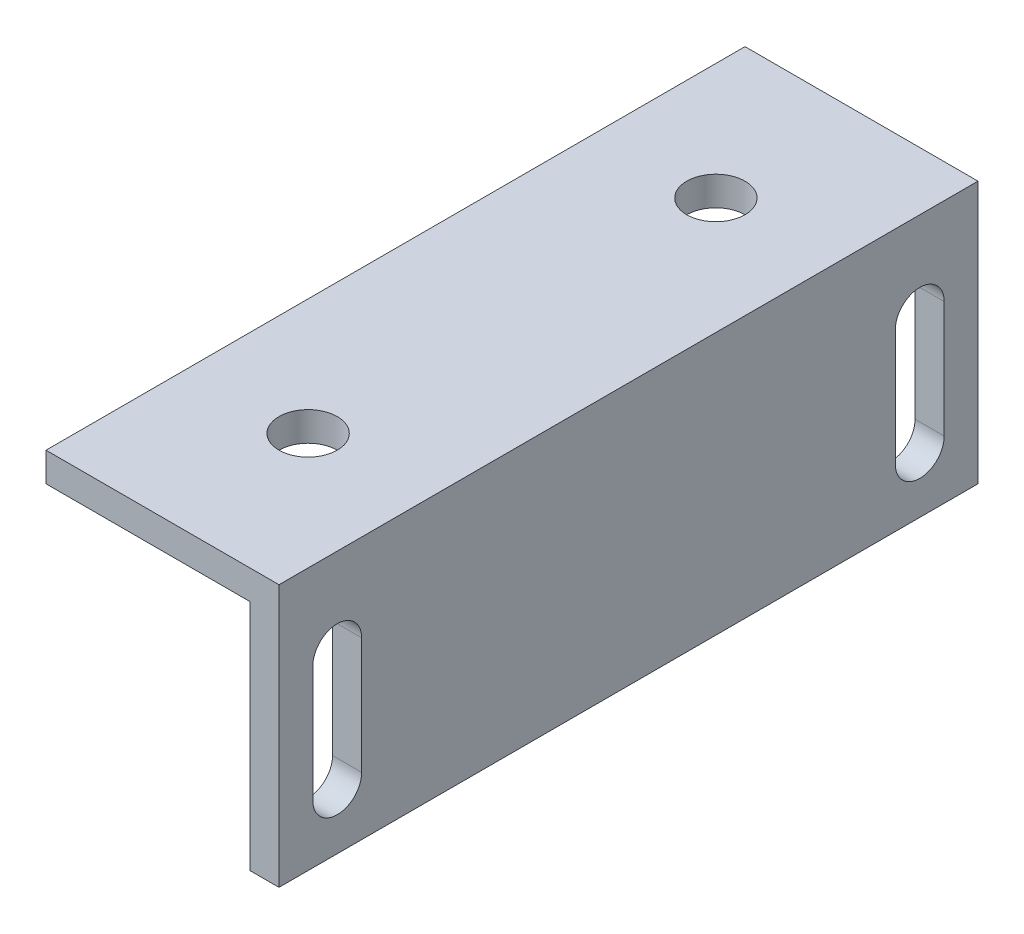
ISO-10303-21;
HEADER;
FILE_DESCRIPTION(('STEP AP214'),'2;1');
FILE_NAME('part.step','',(''),(''),'','','');
FILE_SCHEMA(('AUTOMOTIVE_DESIGN { 1 0 10303 214 1 1 1 1 }'));
ENDSEC;
DATA;
#1=APPLICATION_CONTEXT('core data for automotive mechanical design processes');
#2=APPLICATION_PROTOCOL_DEFINITION('international standard','automotive_design',2000,#1);
#3=PRODUCT_CONTEXT('',#1,'mechanical');
#4=PRODUCT('Part','Part','',(#3));
#5=PRODUCT_RELATED_PRODUCT_CATEGORY('part','',(#4));
#6=PRODUCT_DEFINITION_FORMATION('','',#4);
#7=PRODUCT_DEFINITION_CONTEXT('part definition',#1,'design');
#8=PRODUCT_DEFINITION('design','',#6,#7);
#9=PRODUCT_DEFINITION_SHAPE('','',#8);
#10=(LENGTH_UNIT() NAMED_UNIT(*) SI_UNIT(.MILLI.,.METRE.));
#11=(NAMED_UNIT(*) PLANE_ANGLE_UNIT() SI_UNIT($,.RADIAN.));
#12=(NAMED_UNIT(*) SI_UNIT($,.STERADIAN.) SOLID_ANGLE_UNIT());
#13=UNCERTAINTY_MEASURE_WITH_UNIT(LENGTH_MEASURE(1.E-05),#10,'distance_accuracy_value','');
#14=(GEOMETRIC_REPRESENTATION_CONTEXT(3) GLOBAL_UNCERTAINTY_ASSIGNED_CONTEXT((#13)) GLOBAL_UNIT_ASSIGNED_CONTEXT((#10,
#11,#12)) REPRESENTATION_CONTEXT('',''));
#15=CARTESIAN_POINT('',(0.,0.,0.));
#16=DIRECTION('',(0.,0.,1.));
#17=DIRECTION('',(1.,0.,0.));
#18=AXIS2_PLACEMENT_3D('',#15,#16,#17);
#19=CARTESIAN_POINT('',(0.,-50.8,76.2));
#20=DIRECTION('',(-1.,0.,0.));
#21=DIRECTION('',(0.,0.,1.));
#22=AXIS2_PLACEMENT_3D('',#19,#20,#21);
#23=PLANE('',#22);
#24=DIRECTION('',(0.,-1.,0.));
#25=VECTOR('',#24,1.);
#26=CARTESIAN_POINT('',(0.,-9.525,72.515));
#27=LINE('',#26,#25);
#28=CARTESIAN_POINT('',(0.,-9.525,72.515));
#29=VERTEX_POINT('',#28);
#30=CARTESIAN_POINT('',(0.,-22.225,72.515));
#31=VERTEX_POINT('',#30);
#32=EDGE_CURVE('E169',#29,#31,#27,.T.);
#33=ORIENTED_EDGE('',*,*,#32,.F.);
#34=CARTESIAN_POINT('',(0.,-9.525,69.85));
#35=DIRECTION('',(-1.,0.,0.));
#36=DIRECTION('',(0.,0.,1.));
#37=AXIS2_PLACEMENT_3D('',#34,#35,#36);
#38=CIRCLE('',#37,2.66499999999999);
#39=CARTESIAN_POINT('',(0.,-9.525,67.185));
#40=VERTEX_POINT('',#39);
#41=EDGE_CURVE('E150',#40,#29,#38,.F.);
#42=ORIENTED_EDGE('',*,*,#41,.F.);
#43=DIRECTION('',(0.,1.,0.));
#44=VECTOR('',#43,1.);
#45=CARTESIAN_POINT('',(0.,-9.525,67.185));
#46=LINE('',#45,#44);
#47=CARTESIAN_POINT('',(0.,-22.225,67.185));
#48=VERTEX_POINT('',#47);
#49=EDGE_CURVE('E161',#48,#40,#46,.T.);
#50=ORIENTED_EDGE('',*,*,#49,.F.);
#51=CARTESIAN_POINT('',(0.,-22.225,69.85));
#52=DIRECTION('',(-1.,0.,0.));
#53=DIRECTION('',(0.,0.,1.));
#54=AXIS2_PLACEMENT_3D('',#51,#52,#53);
#55=CIRCLE('',#54,2.66499999999999);
#56=EDGE_CURVE('E60',#31,#48,#55,.F.);
#57=ORIENTED_EDGE('',*,*,#56,.F.);
#58=EDGE_LOOP('',(#33,#42,#50,#57));
#59=FACE_BOUND('',#58,.T.);
#60=DIRECTION('',(0.,-1.,0.));
#61=VECTOR('',#60,1.);
#62=CARTESIAN_POINT('',(0.,-9.52499999999993,9.015));
#63=LINE('',#62,#61);
#64=CARTESIAN_POINT('',(0.,-9.52499999999993,9.015));
#65=VERTEX_POINT('',#64);
#66=CARTESIAN_POINT('',(0.,-22.2249999999999,9.01499999999997));
#67=VERTEX_POINT('',#66);
#68=EDGE_CURVE('E187',#65,#67,#63,.T.);
#69=ORIENTED_EDGE('',*,*,#68,.F.);
#70=CARTESIAN_POINT('',(0.,-9.52499999999993,6.35000000000001));
#71=DIRECTION('',(-1.,0.,0.));
#72=DIRECTION('',(0.,0.,1.));
#73=AXIS2_PLACEMENT_3D('',#70,#71,#72);
#74=CIRCLE('',#73,2.66499999999999);
#75=CARTESIAN_POINT('',(0.,-9.52499999999992,3.68500000000002));
#76=VERTEX_POINT('',#75);
#77=EDGE_CURVE('E190',#76,#65,#74,.F.);
#78=ORIENTED_EDGE('',*,*,#77,.F.);
#79=DIRECTION('',(0.,1.,0.));
#80=VECTOR('',#79,1.);
#81=CARTESIAN_POINT('',(0.,-9.52499999999992,3.68500000000002));
#82=LINE('',#81,#80);
#83=CARTESIAN_POINT('',(0.,-22.2249999999999,3.68499999999999));
#84=VERTEX_POINT('',#83);
#85=EDGE_CURVE('E207',#84,#76,#82,.T.);
#86=ORIENTED_EDGE('',*,*,#85,.F.);
#87=CARTESIAN_POINT('',(0.,-22.2249999999999,6.34999999999998));
#88=DIRECTION('',(-1.,0.,0.));
#89=DIRECTION('',(0.,0.,1.));
#90=AXIS2_PLACEMENT_3D('',#87,#88,#89);
#91=CIRCLE('',#90,2.66499999999999);
#92=EDGE_CURVE('E68',#67,#84,#91,.F.);
#93=ORIENTED_EDGE('',*,*,#92,.F.);
#94=EDGE_LOOP('',(#69,#78,#86,#93));
#95=FACE_BOUND('',#94,.T.);
#96=DIRECTION('',(0.,1.,0.));
#97=VECTOR('',#96,1.);
#98=CARTESIAN_POINT('',(0.,-50.8,76.2));
#99=LINE('',#98,#97);
#100=CARTESIAN_POINT('',(0.,-28.575,76.2));
#101=VERTEX_POINT('',#100);
#102=CARTESIAN_POINT('',(0.,0.,76.2));
#103=VERTEX_POINT('',#102);
#104=EDGE_CURVE('E238',#101,#103,#99,.T.);
#105=ORIENTED_EDGE('',*,*,#104,.F.);
#106=DIRECTION('',(0.,0.,1.));
#107=VECTOR('',#106,1.);
#108=CARTESIAN_POINT('',(0.,-28.575,-0.001000000000001));
#109=LINE('',#108,#107);
#110=CARTESIAN_POINT('',(0.,-28.575,0.));
#111=VERTEX_POINT('',#110);
#112=EDGE_CURVE('E217',#111,#101,#109,.T.);
#113=ORIENTED_EDGE('',*,*,#112,.F.);
#114=DIRECTION('',(0.,1.,0.));
#115=VECTOR('',#114,1.);
#116=CARTESIAN_POINT('',(0.,-50.8,0.));
#117=LINE('',#116,#115);
#118=CARTESIAN_POINT('',(0.,0.,0.));
#119=VERTEX_POINT('',#118);
#120=EDGE_CURVE('E233',#111,#119,#117,.T.);
#121=ORIENTED_EDGE('',*,*,#120,.T.);
#122=DIRECTION('',(0.,0.,-1.));
#123=VECTOR('',#122,1.);
#124=CARTESIAN_POINT('',(0.,0.,76.2));
#125=LINE('',#124,#123);
#126=EDGE_CURVE('E13',#103,#119,#125,.T.);
#127=ORIENTED_EDGE('',*,*,#126,.F.);
#128=EDGE_LOOP('',(#105,#113,#121,#127));
#129=FACE_BOUND('',#128,.T.);
#130=ADVANCED_FACE('F46',(#59,#95,#129),#23,.F.);
#131=CARTESIAN_POINT('',(0.,0.,76.2));
#132=DIRECTION('',(0.,-1.,0.));
#133=DIRECTION('',(0.,0.,-1.));
#134=AXIS2_PLACEMENT_3D('',#131,#132,#133);
#135=PLANE('',#134);
#136=CARTESIAN_POINT('',(-12.7,0.,15.875));
#137=DIRECTION('',(0.,1.,0.));
#138=DIRECTION('',(0.,0.,1.));
#139=AXIS2_PLACEMENT_3D('',#136,#137,#138);
#140=CIRCLE('',#139,3.175);
#141=CARTESIAN_POINT('',(-12.7,0.,19.05));
#142=VERTEX_POINT('',#141);
#143=EDGE_CURVE('E226',#142,#142,#140,.T.);
#144=ORIENTED_EDGE('',*,*,#143,.F.);
#145=EDGE_LOOP('',(#144));
#146=FACE_BOUND('',#145,.T.);
#147=CARTESIAN_POINT('',(-12.7,0.,60.325));
#148=DIRECTION('',(0.,1.,0.));
#149=DIRECTION('',(0.,0.,1.));
#150=AXIS2_PLACEMENT_3D('',#147,#148,#149);
#151=CIRCLE('',#150,3.175);
#152=CARTESIAN_POINT('',(-12.7,0.,63.5));
#153=VERTEX_POINT('',#152);
#154=EDGE_CURVE('E225',#153,#153,#151,.T.);
#155=ORIENTED_EDGE('',*,*,#154,.F.);
#156=EDGE_LOOP('',(#155));
#157=FACE_BOUND('',#156,.T.);
#158=DIRECTION('',(-1.,0.,0.));
#159=VECTOR('',#158,1.);
#160=CARTESIAN_POINT('',(0.,0.,0.));
#161=LINE('',#160,#159);
#162=CARTESIAN_POINT('',(-25.4,0.,0.));
#163=VERTEX_POINT('',#162);
#164=EDGE_CURVE('E252',#119,#163,#161,.T.);
#165=ORIENTED_EDGE('',*,*,#164,.T.);
#166=DIRECTION('',(0.,0.,-1.));
#167=VECTOR('',#166,1.);
#168=CARTESIAN_POINT('',(-25.4,0.,76.2));
#169=LINE('',#168,#167);
#170=CARTESIAN_POINT('',(-25.4,0.,76.2));
#171=VERTEX_POINT('',#170);
#172=EDGE_CURVE('E53',#171,#163,#169,.T.);
#173=ORIENTED_EDGE('',*,*,#172,.F.);
#174=DIRECTION('',(-1.,0.,0.));
#175=VECTOR('',#174,1.);
#176=CARTESIAN_POINT('',(0.,0.,76.2));
#177=LINE('',#176,#175);
#178=EDGE_CURVE('E240',#103,#171,#177,.T.);
#179=ORIENTED_EDGE('',*,*,#178,.F.);
#180=ORIENTED_EDGE('',*,*,#126,.T.);
#181=EDGE_LOOP('',(#165,#173,#179,#180));
#182=FACE_BOUND('',#181,.T.);
#183=ADVANCED_FACE('F291',(#146,#157,#182),#135,.F.);
#184=CARTESIAN_POINT('',(-25.4,0.,76.2));
#185=DIRECTION('',(1.,0.,0.));
#186=DIRECTION('',(0.,0.,-1.));
#187=AXIS2_PLACEMENT_3D('',#184,#185,#186);
#188=PLANE('',#187);
#189=DIRECTION('',(0.,-1.,0.));
#190=VECTOR('',#189,1.);
#191=CARTESIAN_POINT('',(-25.4,0.,0.));
#192=LINE('',#191,#190);
#193=CARTESIAN_POINT('',(-25.4,-3.175,0.));
#194=VERTEX_POINT('',#193);
#195=EDGE_CURVE('E254',#163,#194,#192,.T.);
#196=ORIENTED_EDGE('',*,*,#195,.T.);
#197=DIRECTION('',(0.,0.,-1.));
#198=VECTOR('',#197,1.);
#199=CARTESIAN_POINT('',(-25.4,-3.175,76.2));
#200=LINE('',#199,#198);
#201=CARTESIAN_POINT('',(-25.4,-3.175,76.2));
#202=VERTEX_POINT('',#201);
#203=EDGE_CURVE('E262',#202,#194,#200,.T.);
#204=ORIENTED_EDGE('',*,*,#203,.F.);
#205=DIRECTION('',(0.,-1.,0.));
#206=VECTOR('',#205,1.);
#207=CARTESIAN_POINT('',(-25.4,0.,76.2));
#208=LINE('',#207,#206);
#209=EDGE_CURVE('E243',#171,#202,#208,.T.);
#210=ORIENTED_EDGE('',*,*,#209,.F.);
#211=ORIENTED_EDGE('',*,*,#172,.T.);
#212=EDGE_LOOP('',(#196,#204,#210,#211));
#213=FACE_BOUND('',#212,.T.);
#214=ADVANCED_FACE('F269',(#213),#188,.F.);
#215=CARTESIAN_POINT('',(-3.175,-3.175,76.2));
#216=DIRECTION('',(0.,1.,0.));
#217=DIRECTION('',(0.,0.,1.));
#218=AXIS2_PLACEMENT_3D('',#215,#216,#217);
#219=PLANE('',#218);
#220=CARTESIAN_POINT('',(-12.7,-3.175,15.875));
#221=DIRECTION('',(0.,1.,0.));
#222=DIRECTION('',(0.,0.,1.));
#223=AXIS2_PLACEMENT_3D('',#220,#221,#222);
#224=CIRCLE('',#223,3.175);
#225=CARTESIAN_POINT('',(-12.7,-3.175,19.05));
#226=VERTEX_POINT('',#225);
#227=EDGE_CURVE('E229',#226,#226,#224,.F.);
#228=ORIENTED_EDGE('',*,*,#227,.F.);
#229=EDGE_LOOP('',(#228));
#230=FACE_BOUND('',#229,.T.);
#231=CARTESIAN_POINT('',(-12.7,-3.175,60.325));
#232=DIRECTION('',(0.,1.,0.));
#233=DIRECTION('',(0.,0.,1.));
#234=AXIS2_PLACEMENT_3D('',#231,#232,#233);
#235=CIRCLE('',#234,3.175);
#236=CARTESIAN_POINT('',(-12.7,-3.175,63.5));
#237=VERTEX_POINT('',#236);
#238=EDGE_CURVE('E230',#237,#237,#235,.F.);
#239=ORIENTED_EDGE('',*,*,#238,.F.);
#240=EDGE_LOOP('',(#239));
#241=FACE_BOUND('',#240,.T.);
#242=DIRECTION('',(1.,0.,0.));
#243=VECTOR('',#242,1.);
#244=CARTESIAN_POINT('',(-3.175,-3.175,0.));
#245=LINE('',#244,#243);
#246=CARTESIAN_POINT('',(-3.175,-3.175,0.));
#247=VERTEX_POINT('',#246);
#248=EDGE_CURVE('E256',#194,#247,#245,.T.);
#249=ORIENTED_EDGE('',*,*,#248,.T.);
#250=DIRECTION('',(0.,0.,-1.));
#251=VECTOR('',#250,1.);
#252=CARTESIAN_POINT('',(-3.175,-3.175,76.2));
#253=LINE('',#252,#251);
#254=CARTESIAN_POINT('',(-3.175,-3.175,76.2));
#255=VERTEX_POINT('',#254);
#256=EDGE_CURVE('E250',#255,#247,#253,.T.);
#257=ORIENTED_EDGE('',*,*,#256,.F.);
#258=DIRECTION('',(1.,0.,0.));
#259=VECTOR('',#258,1.);
#260=CARTESIAN_POINT('',(-3.175,-3.175,76.2));
#261=LINE('',#260,#259);
#262=EDGE_CURVE('E245',#202,#255,#261,.T.);
#263=ORIENTED_EDGE('',*,*,#262,.F.);
#264=ORIENTED_EDGE('',*,*,#203,.T.);
#265=EDGE_LOOP('',(#249,#257,#263,#264));
#266=FACE_BOUND('',#265,.T.);
#267=ADVANCED_FACE('F281',(#230,#241,#266),#219,.F.);
#268=CARTESIAN_POINT('',(-3.175,-50.8,76.2));
#269=DIRECTION('',(1.,0.,0.));
#270=DIRECTION('',(0.,0.,-1.));
#271=AXIS2_PLACEMENT_3D('',#268,#269,#270);
#272=PLANE('',#271);
#273=DIRECTION('',(0.,-1.,0.));
#274=VECTOR('',#273,1.);
#275=CARTESIAN_POINT('',(-3.175,-9.525,67.185));
#276=LINE('',#275,#274);
#277=CARTESIAN_POINT('',(-3.175,-9.525,67.185));
#278=VERTEX_POINT('',#277);
#279=CARTESIAN_POINT('',(-3.175,-22.225,67.185));
#280=VERTEX_POINT('',#279);
#281=EDGE_CURVE('E171',#278,#280,#276,.T.);
#282=ORIENTED_EDGE('',*,*,#281,.F.);
#283=CARTESIAN_POINT('',(-3.175,-9.525,69.85));
#284=DIRECTION('',(-1.,0.,0.));
#285=DIRECTION('',(0.,0.,1.));
#286=AXIS2_PLACEMENT_3D('',#283,#284,#285);
#287=CIRCLE('',#286,2.66499999999999);
#288=CARTESIAN_POINT('',(-3.175,-9.525,72.515));
#289=VERTEX_POINT('',#288);
#290=EDGE_CURVE('E153',#289,#278,#287,.T.);
#291=ORIENTED_EDGE('',*,*,#290,.F.);
#292=DIRECTION('',(0.,1.,0.));
#293=VECTOR('',#292,1.);
#294=CARTESIAN_POINT('',(-3.175,-9.525,72.515));
#295=LINE('',#294,#293);
#296=CARTESIAN_POINT('',(-3.175,-22.225,72.515));
#297=VERTEX_POINT('',#296);
#298=EDGE_CURVE('E158',#297,#289,#295,.T.);
#299=ORIENTED_EDGE('',*,*,#298,.F.);
#300=CARTESIAN_POINT('',(-3.175,-22.225,69.85));
#301=DIRECTION('',(-1.,0.,0.));
#302=DIRECTION('',(0.,0.,1.));
#303=AXIS2_PLACEMENT_3D('',#300,#301,#302);
#304=CIRCLE('',#303,2.66499999999999);
#305=EDGE_CURVE('E177',#280,#297,#304,.T.);
#306=ORIENTED_EDGE('',*,*,#305,.F.);
#307=EDGE_LOOP('',(#282,#291,#299,#306));
#308=FACE_BOUND('',#307,.T.);
#309=DIRECTION('',(0.,-1.,0.));
#310=VECTOR('',#309,1.);
#311=CARTESIAN_POINT('',(-3.175,-9.52499999999992,3.68500000000002));
#312=LINE('',#311,#310);
#313=CARTESIAN_POINT('',(-3.175,-9.52499999999993,3.68500000000001));
#314=VERTEX_POINT('',#313);
#315=CARTESIAN_POINT('',(-3.175,-22.2249999999999,3.68499999999999));
#316=VERTEX_POINT('',#315);
#317=EDGE_CURVE('E195',#314,#316,#312,.T.);
#318=ORIENTED_EDGE('',*,*,#317,.F.);
#319=CARTESIAN_POINT('',(-3.175,-9.52499999999993,6.35000000000001));
#320=DIRECTION('',(-1.,0.,0.));
#321=DIRECTION('',(0.,0.,-1.));
#322=AXIS2_PLACEMENT_3D('',#319,#320,#321);
#323=CIRCLE('',#322,2.66499999999999);
#324=CARTESIAN_POINT('',(-3.175,-9.52499999999993,9.015));
#325=VERTEX_POINT('',#324);
#326=EDGE_CURVE('E193',#325,#314,#323,.T.);
#327=ORIENTED_EDGE('',*,*,#326,.F.);
#328=DIRECTION('',(0.,1.,0.));
#329=VECTOR('',#328,1.);
#330=CARTESIAN_POINT('',(-3.175,-9.52499999999993,9.015));
#331=LINE('',#330,#329);
#332=CARTESIAN_POINT('',(-3.175,-22.2249999999999,9.01499999999997));
#333=VERTEX_POINT('',#332);
#334=EDGE_CURVE('E201',#333,#325,#331,.T.);
#335=ORIENTED_EDGE('',*,*,#334,.F.);
#336=CARTESIAN_POINT('',(-3.175,-22.2249999999999,6.34999999999998));
#337=DIRECTION('',(-1.,0.,0.));
#338=DIRECTION('',(0.,0.,-1.));
#339=AXIS2_PLACEMENT_3D('',#336,#337,#338);
#340=CIRCLE('',#339,2.66499999999999);
#341=EDGE_CURVE('E198',#316,#333,#340,.T.);
#342=ORIENTED_EDGE('',*,*,#341,.F.);
#343=EDGE_LOOP('',(#318,#327,#335,#342));
#344=FACE_BOUND('',#343,.T.);
#345=DIRECTION('',(0.,-1.,0.));
#346=VECTOR('',#345,1.);
#347=CARTESIAN_POINT('',(-3.175,-50.8,0.));
#348=LINE('',#347,#346);
#349=CARTESIAN_POINT('',(-3.175,-28.575,0.));
#350=VERTEX_POINT('',#349);
#351=EDGE_CURVE('E241',#247,#350,#348,.T.);
#352=ORIENTED_EDGE('',*,*,#351,.T.);
#353=DIRECTION('',(0.,0.,1.));
#354=VECTOR('',#353,1.);
#355=CARTESIAN_POINT('',(-3.175,-28.575,-0.001000000000001));
#356=LINE('',#355,#354);
#357=CARTESIAN_POINT('',(-3.175,-28.575,76.2));
#358=VERTEX_POINT('',#357);
#359=EDGE_CURVE('E218',#350,#358,#356,.T.);
#360=ORIENTED_EDGE('',*,*,#359,.T.);
#361=DIRECTION('',(0.,-1.,0.));
#362=VECTOR('',#361,1.);
#363=CARTESIAN_POINT('',(-3.175,-50.8,76.2));
#364=LINE('',#363,#362);
#365=EDGE_CURVE('E247',#255,#358,#364,.T.);
#366=ORIENTED_EDGE('',*,*,#365,.F.);
#367=ORIENTED_EDGE('',*,*,#256,.T.);
#368=EDGE_LOOP('',(#352,#360,#366,#367));
#369=FACE_BOUND('',#368,.T.);
#370=ADVANCED_FACE('F285',(#308,#344,#369),#272,.F.);
#371=CARTESIAN_POINT('',(0.,0.,76.2));
#372=DIRECTION('',(0.,0.,-1.));
#373=DIRECTION('',(-1.,0.,0.));
#374=AXIS2_PLACEMENT_3D('',#371,#372,#373);
#375=PLANE('',#374);
#376=ORIENTED_EDGE('',*,*,#365,.T.);
#377=DIRECTION('',(-1.,0.,0.));
#378=VECTOR('',#377,1.);
#379=CARTESIAN_POINT('',(0.,-28.575,76.2));
#380=LINE('',#379,#378);
#381=EDGE_CURVE('E164',#101,#358,#380,.T.);
#382=ORIENTED_EDGE('',*,*,#381,.F.);
#383=ORIENTED_EDGE('',*,*,#104,.T.);
#384=ORIENTED_EDGE('',*,*,#178,.T.);
#385=ORIENTED_EDGE('',*,*,#209,.T.);
#386=ORIENTED_EDGE('',*,*,#262,.T.);
#387=EDGE_LOOP('',(#376,#382,#383,#384,#385,#386));
#388=FACE_BOUND('',#387,.T.);
#389=ADVANCED_FACE('F288',(#388),#375,.F.);
#390=CARTESIAN_POINT('',(0.,0.,0.));
#391=DIRECTION('',(0.,0.,-1.));
#392=DIRECTION('',(-1.,0.,0.));
#393=AXIS2_PLACEMENT_3D('',#390,#391,#392);
#394=PLANE('',#393);
#395=DIRECTION('',(-1.,0.,0.));
#396=VECTOR('',#395,1.);
#397=CARTESIAN_POINT('',(0.,-28.575,0.));
#398=LINE('',#397,#396);
#399=EDGE_CURVE('E221',#111,#350,#398,.T.);
#400=ORIENTED_EDGE('',*,*,#399,.T.);
#401=ORIENTED_EDGE('',*,*,#351,.F.);
#402=ORIENTED_EDGE('',*,*,#248,.F.);
#403=ORIENTED_EDGE('',*,*,#195,.F.);
#404=ORIENTED_EDGE('',*,*,#164,.F.);
#405=ORIENTED_EDGE('',*,*,#120,.F.);
#406=EDGE_LOOP('',(#400,#401,#402,#403,#404,#405));
#407=FACE_BOUND('',#406,.T.);
#408=ADVANCED_FACE('F276',(#407),#394,.T.);
#409=CARTESIAN_POINT('',(-12.7,-50.801,60.325));
#410=DIRECTION('',(0.,1.,0.));
#411=DIRECTION('',(0.,0.,1.));
#412=AXIS2_PLACEMENT_3D('',#409,#410,#411);
#413=CYLINDRICAL_SURFACE('',#412,3.175);
#414=ORIENTED_EDGE('',*,*,#154,.T.);
#415=EDGE_LOOP('',(#414));
#416=FACE_BOUND('',#415,.T.);
#417=ORIENTED_EDGE('',*,*,#238,.T.);
#418=EDGE_LOOP('',(#417));
#419=FACE_BOUND('',#418,.T.);
#420=ADVANCED_FACE('F307',(#416,#419),#413,.F.);
#421=CARTESIAN_POINT('',(-12.7,-50.801,15.875));
#422=DIRECTION('',(0.,1.,0.));
#423=DIRECTION('',(0.,0.,1.));
#424=AXIS2_PLACEMENT_3D('',#421,#422,#423);
#425=CYLINDRICAL_SURFACE('',#424,3.175);
#426=ORIENTED_EDGE('',*,*,#143,.T.);
#427=EDGE_LOOP('',(#426));
#428=FACE_BOUND('',#427,.T.);
#429=ORIENTED_EDGE('',*,*,#227,.T.);
#430=EDGE_LOOP('',(#429));
#431=FACE_BOUND('',#430,.T.);
#432=ADVANCED_FACE('F298',(#428,#431),#425,.F.);
#433=CARTESIAN_POINT('',(0.,-28.575,-0.001000000000001));
#434=DIRECTION('',(0.,1.,0.));
#435=DIRECTION('',(0.,0.,1.));
#436=AXIS2_PLACEMENT_3D('',#433,#434,#435);
#437=PLANE('',#436);
#438=ORIENTED_EDGE('',*,*,#112,.T.);
#439=ORIENTED_EDGE('',*,*,#381,.T.);
#440=ORIENTED_EDGE('',*,*,#359,.F.);
#441=ORIENTED_EDGE('',*,*,#399,.F.);
#442=EDGE_LOOP('',(#438,#439,#440,#441));
#443=FACE_BOUND('',#442,.T.);
#444=ADVANCED_FACE('F295',(#443),#437,.F.);
#445=CARTESIAN_POINT('',(0.001000000000001,-9.52499999999993,6.35000000000001));
#446=DIRECTION('',(-1.,0.,0.));
#447=DIRECTION('',(0.,0.,1.));
#448=AXIS2_PLACEMENT_3D('',#445,#446,#447);
#449=CYLINDRICAL_SURFACE('',#448,2.66499999999999);
#450=ORIENTED_EDGE('',*,*,#77,.T.);
#451=DIRECTION('',(-1.,0.,0.));
#452=VECTOR('',#451,1.);
#453=CARTESIAN_POINT('',(0.001000000000001,-9.52499999999993,9.015));
#454=LINE('',#453,#452);
#455=EDGE_CURVE('E205',#65,#325,#454,.T.);
#456=ORIENTED_EDGE('',*,*,#455,.T.);
#457=ORIENTED_EDGE('',*,*,#326,.T.);
#458=DIRECTION('',(-1.,0.,0.));
#459=VECTOR('',#458,1.);
#460=CARTESIAN_POINT('',(0.001000000000001,-9.52499999999992,3.68500000000002));
#461=LINE('',#460,#459);
#462=EDGE_CURVE('E204',#76,#314,#461,.T.);
#463=ORIENTED_EDGE('',*,*,#462,.F.);
#464=EDGE_LOOP('',(#450,#456,#457,#463));
#465=FACE_BOUND('',#464,.T.);
#466=ADVANCED_FACE('F297',(#465),#449,.F.);
#467=CARTESIAN_POINT('',(0.001000000000001,-9.52499999999993,9.015));
#468=DIRECTION('',(0.,0.,1.));
#469=DIRECTION('',(0.,-1.,0.));
#470=AXIS2_PLACEMENT_3D('',#467,#468,#469);
#471=PLANE('',#470);
#472=ORIENTED_EDGE('',*,*,#68,.T.);
#473=DIRECTION('',(-1.,0.,0.));
#474=VECTOR('',#473,1.);
#475=CARTESIAN_POINT('',(0.001000000000001,-22.2249999999999,9.01499999999997));
#476=LINE('',#475,#474);
#477=EDGE_CURVE('E208',#67,#333,#476,.T.);
#478=ORIENTED_EDGE('',*,*,#477,.T.);
#479=ORIENTED_EDGE('',*,*,#334,.T.);
#480=ORIENTED_EDGE('',*,*,#455,.F.);
#481=EDGE_LOOP('',(#472,#478,#479,#480));
#482=FACE_BOUND('',#481,.T.);
#483=ADVANCED_FACE('F304',(#482),#471,.F.);
#484=CARTESIAN_POINT('',(0.001000000000001,-22.2249999999999,6.34999999999998));
#485=DIRECTION('',(-1.,0.,0.));
#486=DIRECTION('',(0.,0.,1.));
#487=AXIS2_PLACEMENT_3D('',#484,#485,#486);
#488=CYLINDRICAL_SURFACE('',#487,2.66499999999999);
#489=ORIENTED_EDGE('',*,*,#92,.T.);
#490=DIRECTION('',(-1.,0.,0.));
#491=VECTOR('',#490,1.);
#492=CARTESIAN_POINT('',(0.001000000000001,-22.2249999999999,3.68499999999999));
#493=LINE('',#492,#491);
#494=EDGE_CURVE('E210',#84,#316,#493,.T.);
#495=ORIENTED_EDGE('',*,*,#494,.T.);
#496=ORIENTED_EDGE('',*,*,#341,.T.);
#497=ORIENTED_EDGE('',*,*,#477,.F.);
#498=EDGE_LOOP('',(#489,#495,#496,#497));
#499=FACE_BOUND('',#498,.T.);
#500=ADVANCED_FACE('F388',(#499),#488,.F.);
#501=CARTESIAN_POINT('',(0.001000000000001,-9.52499999999992,3.68500000000002));
#502=DIRECTION('',(0.,0.,-1.));
#503=DIRECTION('',(0.,1.,0.));
#504=AXIS2_PLACEMENT_3D('',#501,#502,#503);
#505=PLANE('',#504);
#506=ORIENTED_EDGE('',*,*,#85,.T.);
#507=ORIENTED_EDGE('',*,*,#462,.T.);
#508=ORIENTED_EDGE('',*,*,#317,.T.);
#509=ORIENTED_EDGE('',*,*,#494,.F.);
#510=EDGE_LOOP('',(#506,#507,#508,#509));
#511=FACE_BOUND('',#510,.T.);
#512=ADVANCED_FACE('F398',(#511),#505,.F.);
#513=CARTESIAN_POINT('',(0.001000000000001,-9.525,69.85));
#514=DIRECTION('',(-1.,0.,0.));
#515=DIRECTION('',(0.,0.,1.));
#516=AXIS2_PLACEMENT_3D('',#513,#514,#515);
#517=CYLINDRICAL_SURFACE('',#516,2.66499999999999);
#518=ORIENTED_EDGE('',*,*,#41,.T.);
#519=DIRECTION('',(-1.,0.,0.));
#520=VECTOR('',#519,1.);
#521=CARTESIAN_POINT('',(0.001000000000001,-9.525,72.515));
#522=LINE('',#521,#520);
#523=EDGE_CURVE('E165',#29,#289,#522,.T.);
#524=ORIENTED_EDGE('',*,*,#523,.T.);
#525=ORIENTED_EDGE('',*,*,#290,.T.);
#526=DIRECTION('',(-1.,0.,0.));
#527=VECTOR('',#526,1.);
#528=CARTESIAN_POINT('',(0.001000000000001,-9.525,67.185));
#529=LINE('',#528,#527);
#530=EDGE_CURVE('E146',#40,#278,#529,.T.);
#531=ORIENTED_EDGE('',*,*,#530,.F.);
#532=EDGE_LOOP('',(#518,#524,#525,#531));
#533=FACE_BOUND('',#532,.T.);
#534=ADVANCED_FACE('F148',(#533),#517,.F.);
#535=CARTESIAN_POINT('',(0.001000000000001,-9.525,72.515));
#536=DIRECTION('',(0.,0.,1.));
#537=DIRECTION('',(1.,0.,0.));
#538=AXIS2_PLACEMENT_3D('',#535,#536,#537);
#539=PLANE('',#538);
#540=ORIENTED_EDGE('',*,*,#32,.T.);
#541=DIRECTION('',(-1.,0.,0.));
#542=VECTOR('',#541,1.);
#543=CARTESIAN_POINT('',(0.001000000000001,-22.225,72.515));
#544=LINE('',#543,#542);
#545=EDGE_CURVE('E183',#31,#297,#544,.T.);
#546=ORIENTED_EDGE('',*,*,#545,.T.);
#547=ORIENTED_EDGE('',*,*,#298,.T.);
#548=ORIENTED_EDGE('',*,*,#523,.F.);
#549=EDGE_LOOP('',(#540,#546,#547,#548));
#550=FACE_BOUND('',#549,.T.);
#551=ADVANCED_FACE('F416',(#550),#539,.F.);
#552=CARTESIAN_POINT('',(0.001000000000001,-22.225,69.85));
#553=DIRECTION('',(-1.,0.,0.));
#554=DIRECTION('',(0.,0.,1.));
#555=AXIS2_PLACEMENT_3D('',#552,#553,#554);
#556=CYLINDRICAL_SURFACE('',#555,2.66499999999999);
#557=ORIENTED_EDGE('',*,*,#56,.T.);
#558=DIRECTION('',(-1.,0.,0.));
#559=VECTOR('',#558,1.);
#560=CARTESIAN_POINT('',(0.001000000000001,-22.225,67.185));
#561=LINE('',#560,#559);
#562=EDGE_CURVE('E157',#48,#280,#561,.T.);
#563=ORIENTED_EDGE('',*,*,#562,.T.);
#564=ORIENTED_EDGE('',*,*,#305,.T.);
#565=ORIENTED_EDGE('',*,*,#545,.F.);
#566=EDGE_LOOP('',(#557,#563,#564,#565));
#567=FACE_BOUND('',#566,.T.);
#568=ADVANCED_FACE('F425',(#567),#556,.F.);
#569=CARTESIAN_POINT('',(0.001000000000001,-9.525,67.185));
#570=DIRECTION('',(0.,0.,-1.));
#571=DIRECTION('',(-1.,0.,0.));
#572=AXIS2_PLACEMENT_3D('',#569,#570,#571);
#573=PLANE('',#572);
#574=ORIENTED_EDGE('',*,*,#49,.T.);
#575=ORIENTED_EDGE('',*,*,#530,.T.);
#576=ORIENTED_EDGE('',*,*,#281,.T.);
#577=ORIENTED_EDGE('',*,*,#562,.F.);
#578=EDGE_LOOP('',(#574,#575,#576,#577));
#579=FACE_BOUND('',#578,.T.);
#580=ADVANCED_FACE('F162',(#579),#573,.F.);
#581=CLOSED_SHELL('',(#130,#183,#214,#267,#370,#389,#408,#420,#432,#444,#466,#483,#500,#512,
#534,#551,#568,#580));
#582=MANIFOLD_SOLID_BREP('B2',#581);
#583=ADVANCED_BREP_SHAPE_REPRESENTATION('',(#18,#582),#14);
#584=SHAPE_DEFINITION_REPRESENTATION(#9,#583);
ENDSEC;
END-ISO-10303-21;
